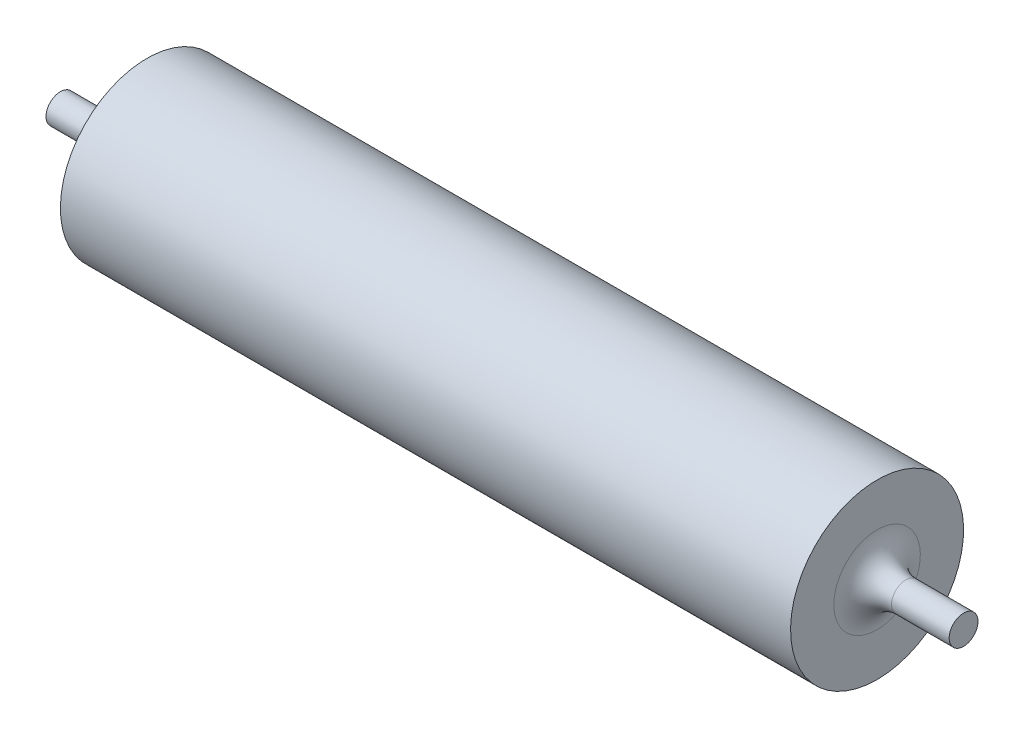
ISO-10303-21;
HEADER;
FILE_DESCRIPTION(('STEP AP214'),'2;1');
FILE_NAME('part.step','',(''),(''),'','','');
FILE_SCHEMA(('AUTOMOTIVE_DESIGN { 1 0 10303 214 1 1 1 1 }'));
ENDSEC;
DATA;
#1=APPLICATION_CONTEXT('core data for automotive mechanical design processes');
#2=APPLICATION_PROTOCOL_DEFINITION('international standard','automotive_design',2000,#1);
#3=PRODUCT_CONTEXT('',#1,'mechanical');
#4=PRODUCT('Part','Part','',(#3));
#5=PRODUCT_RELATED_PRODUCT_CATEGORY('part','',(#4));
#6=PRODUCT_DEFINITION_FORMATION('','',#4);
#7=PRODUCT_DEFINITION_CONTEXT('part definition',#1,'design');
#8=PRODUCT_DEFINITION('design','',#6,#7);
#9=PRODUCT_DEFINITION_SHAPE('','',#8);
#10=(LENGTH_UNIT() NAMED_UNIT(*) SI_UNIT(.MILLI.,.METRE.));
#11=(NAMED_UNIT(*) PLANE_ANGLE_UNIT() SI_UNIT($,.RADIAN.));
#12=(NAMED_UNIT(*) SI_UNIT($,.STERADIAN.) SOLID_ANGLE_UNIT());
#13=UNCERTAINTY_MEASURE_WITH_UNIT(LENGTH_MEASURE(1.E-05),#10,'distance_accuracy_value','');
#14=(GEOMETRIC_REPRESENTATION_CONTEXT(3) GLOBAL_UNCERTAINTY_ASSIGNED_CONTEXT((#13)) GLOBAL_UNIT_ASSIGNED_CONTEXT((#10,
#11,#12)) REPRESENTATION_CONTEXT('',''));
#15=CARTESIAN_POINT('',(0.,0.,0.));
#16=DIRECTION('',(0.,0.,1.));
#17=DIRECTION('',(1.,0.,0.));
#18=AXIS2_PLACEMENT_3D('',#15,#16,#17);
#19=CARTESIAN_POINT('',(78.3,0.,0.));
#20=DIRECTION('',(-1.,0.,0.));
#21=DIRECTION('',(0.,-1.,0.));
#22=AXIS2_PLACEMENT_3D('',#19,#20,#21);
#23=PLANE('',#22);
#24=CARTESIAN_POINT('',(78.3,0.,0.));
#25=DIRECTION('',(-1.,0.,0.));
#26=DIRECTION('',(0.,-1.,0.));
#27=AXIS2_PLACEMENT_3D('',#24,#25,#26);
#28=CIRCLE('',#27,2.5);
#29=CARTESIAN_POINT('',(78.3,-2.49999999999998,0.));
#30=VERTEX_POINT('',#29);
#31=EDGE_CURVE('E50',#30,#30,#28,.T.);
#32=ORIENTED_EDGE('',*,*,#31,.F.);
#33=EDGE_LOOP('',(#32));
#34=FACE_BOUND('',#33,.T.);
#35=ADVANCED_FACE('F30',(#34),#23,.F.);
#36=CARTESIAN_POINT('',(-78.3,0.,0.));
#37=DIRECTION('',(-1.,0.,0.));
#38=DIRECTION('',(0.,-1.,0.));
#39=AXIS2_PLACEMENT_3D('',#36,#37,#38);
#40=CYLINDRICAL_SURFACE('',#39,2.5);
#41=CARTESIAN_POINT('',(68.3,0.,0.));
#42=DIRECTION('',(-1.,0.,0.));
#43=DIRECTION('',(0.,-1.,0.));
#44=AXIS2_PLACEMENT_3D('',#41,#42,#43);
#45=CIRCLE('',#44,2.5);
#46=CARTESIAN_POINT('',(68.3,-2.49999999999998,0.));
#47=VERTEX_POINT('',#46);
#48=EDGE_CURVE('E41',#47,#47,#45,.F.);
#49=ORIENTED_EDGE('',*,*,#48,.T.);
#50=EDGE_LOOP('',(#49));
#51=FACE_BOUND('',#50,.T.);
#52=ORIENTED_EDGE('',*,*,#31,.T.);
#53=EDGE_LOOP('',(#52));
#54=FACE_BOUND('',#53,.T.);
#55=ADVANCED_FACE('F78',(#51,#54),#40,.T.);
#56=CARTESIAN_POINT('',(63.3,2.50000000000002,0.));
#57=DIRECTION('',(-1.,0.,0.));
#58=DIRECTION('',(0.,-1.,0.));
#59=AXIS2_PLACEMENT_3D('',#56,#57,#58);
#60=PLANE('',#59);
#61=CARTESIAN_POINT('',(63.3,0.,0.));
#62=DIRECTION('',(-1.,0.,0.));
#63=DIRECTION('',(0.,-1.,0.));
#64=AXIS2_PLACEMENT_3D('',#61,#62,#63);
#65=CIRCLE('',#64,7.5);
#66=CARTESIAN_POINT('',(63.3,-7.49999999999998,0.));
#67=VERTEX_POINT('',#66);
#68=EDGE_CURVE('E45',#67,#67,#65,.T.);
#69=ORIENTED_EDGE('',*,*,#68,.T.);
#70=EDGE_LOOP('',(#69));
#71=FACE_BOUND('',#70,.T.);
#72=CARTESIAN_POINT('',(63.3,0.,0.));
#73=DIRECTION('',(-1.,0.,0.));
#74=DIRECTION('',(0.,-1.,0.));
#75=AXIS2_PLACEMENT_3D('',#72,#73,#74);
#76=CIRCLE('',#75,15.);
#77=CARTESIAN_POINT('',(63.3,-15.,0.));
#78=VERTEX_POINT('',#77);
#79=EDGE_CURVE('E53',#78,#78,#76,.T.);
#80=ORIENTED_EDGE('',*,*,#79,.F.);
#81=EDGE_LOOP('',(#80));
#82=FACE_BOUND('',#81,.T.);
#83=ADVANCED_FACE('F84',(#71,#82),#60,.F.);
#84=CARTESIAN_POINT('',(-78.3,0.,0.));
#85=DIRECTION('',(-1.,0.,0.));
#86=DIRECTION('',(0.,-1.,0.));
#87=AXIS2_PLACEMENT_3D('',#84,#85,#86);
#88=CYLINDRICAL_SURFACE('',#87,15.);
#89=CARTESIAN_POINT('',(-63.3,0.,0.));
#90=DIRECTION('',(-1.,0.,0.));
#91=DIRECTION('',(0.,-1.,0.));
#92=AXIS2_PLACEMENT_3D('',#89,#90,#91);
#93=CIRCLE('',#92,15.);
#94=CARTESIAN_POINT('',(-63.3,-15.,0.));
#95=VERTEX_POINT('',#94);
#96=EDGE_CURVE('E56',#95,#95,#93,.T.);
#97=ORIENTED_EDGE('',*,*,#96,.F.);
#98=EDGE_LOOP('',(#97));
#99=FACE_BOUND('',#98,.T.);
#100=ORIENTED_EDGE('',*,*,#79,.T.);
#101=EDGE_LOOP('',(#100));
#102=FACE_BOUND('',#101,.T.);
#103=ADVANCED_FACE('F75',(#99,#102),#88,.T.);
#104=CARTESIAN_POINT('',(-63.3,2.5,0.));
#105=DIRECTION('',(1.,0.,0.));
#106=DIRECTION('',(0.,1.,0.));
#107=AXIS2_PLACEMENT_3D('',#104,#105,#106);
#108=PLANE('',#107);
#109=CARTESIAN_POINT('',(-63.3,0.,0.));
#110=DIRECTION('',(1.,0.,0.));
#111=DIRECTION('',(0.,1.,0.));
#112=AXIS2_PLACEMENT_3D('',#109,#110,#111);
#113=CIRCLE('',#112,7.5);
#114=CARTESIAN_POINT('',(-63.3,7.5,0.));
#115=VERTEX_POINT('',#114);
#116=EDGE_CURVE('E10',#115,#115,#113,.T.);
#117=ORIENTED_EDGE('',*,*,#116,.T.);
#118=EDGE_LOOP('',(#117));
#119=FACE_BOUND('',#118,.T.);
#120=ORIENTED_EDGE('',*,*,#96,.T.);
#121=EDGE_LOOP('',(#120));
#122=FACE_BOUND('',#121,.T.);
#123=ADVANCED_FACE('F67',(#119,#122),#108,.F.);
#124=CARTESIAN_POINT('',(-78.3,0.,0.));
#125=DIRECTION('',(-1.,0.,0.));
#126=DIRECTION('',(0.,-1.,0.));
#127=AXIS2_PLACEMENT_3D('',#124,#125,#126);
#128=CYLINDRICAL_SURFACE('',#127,2.5);
#129=CARTESIAN_POINT('',(-68.3,0.,0.));
#130=DIRECTION('',(1.,0.,0.));
#131=DIRECTION('',(0.,1.,0.));
#132=AXIS2_PLACEMENT_3D('',#129,#130,#131);
#133=CIRCLE('',#132,2.5);
#134=CARTESIAN_POINT('',(-68.3,2.5,0.));
#135=VERTEX_POINT('',#134);
#136=EDGE_CURVE('E37',#135,#135,#133,.F.);
#137=ORIENTED_EDGE('',*,*,#136,.T.);
#138=EDGE_LOOP('',(#137));
#139=FACE_BOUND('',#138,.T.);
#140=CARTESIAN_POINT('',(-78.3,0.,0.));
#141=DIRECTION('',(-1.,0.,0.));
#142=DIRECTION('',(0.,-1.,0.));
#143=AXIS2_PLACEMENT_3D('',#140,#141,#142);
#144=CIRCLE('',#143,2.5);
#145=CARTESIAN_POINT('',(-78.3,-2.5,0.));
#146=VERTEX_POINT('',#145);
#147=EDGE_CURVE('E59',#146,#146,#144,.T.);
#148=ORIENTED_EDGE('',*,*,#147,.F.);
#149=EDGE_LOOP('',(#148));
#150=FACE_BOUND('',#149,.T.);
#151=ADVANCED_FACE('F65',(#139,#150),#128,.T.);
#152=CARTESIAN_POINT('',(-78.3,0.,0.));
#153=DIRECTION('',(1.,0.,0.));
#154=DIRECTION('',(0.,1.,0.));
#155=AXIS2_PLACEMENT_3D('',#152,#153,#154);
#156=PLANE('',#155);
#157=ORIENTED_EDGE('',*,*,#147,.T.);
#158=EDGE_LOOP('',(#157));
#159=FACE_BOUND('',#158,.T.);
#160=ADVANCED_FACE('F63',(#159),#156,.F.);
#161=CARTESIAN_POINT('',(68.3,0.,0.));
#162=DIRECTION('',(-1.,0.,0.));
#163=DIRECTION('',(0.,-1.,0.));
#164=AXIS2_PLACEMENT_3D('',#161,#162,#163);
#165=TOROIDAL_SURFACE('',#164,7.5,5.);
#166=ORIENTED_EDGE('',*,*,#48,.F.);
#167=EDGE_LOOP('',(#166));
#168=FACE_BOUND('',#167,.T.);
#169=ORIENTED_EDGE('',*,*,#68,.F.);
#170=EDGE_LOOP('',(#169));
#171=FACE_BOUND('',#170,.T.);
#172=ADVANCED_FACE('F73',(#168,#171),#165,.F.);
#173=CARTESIAN_POINT('',(-68.3,0.,0.));
#174=DIRECTION('',(1.,0.,0.));
#175=DIRECTION('',(0.,1.,0.));
#176=AXIS2_PLACEMENT_3D('',#173,#174,#175);
#177=TOROIDAL_SURFACE('',#176,7.5,5.);
#178=ORIENTED_EDGE('',*,*,#116,.F.);
#179=EDGE_LOOP('',(#178));
#180=FACE_BOUND('',#179,.T.);
#181=ORIENTED_EDGE('',*,*,#136,.F.);
#182=EDGE_LOOP('',(#181));
#183=FACE_BOUND('',#182,.T.);
#184=ADVANCED_FACE('F32',(#180,#183),#177,.F.);
#185=CLOSED_SHELL('',(#35,#55,#83,#103,#123,#151,#160,#172,#184));
#186=MANIFOLD_SOLID_BREP('B2',#185);
#187=ADVANCED_BREP_SHAPE_REPRESENTATION('',(#18,#186),#14);
#188=SHAPE_DEFINITION_REPRESENTATION(#9,#187);
ENDSEC;
END-ISO-10303-21;
